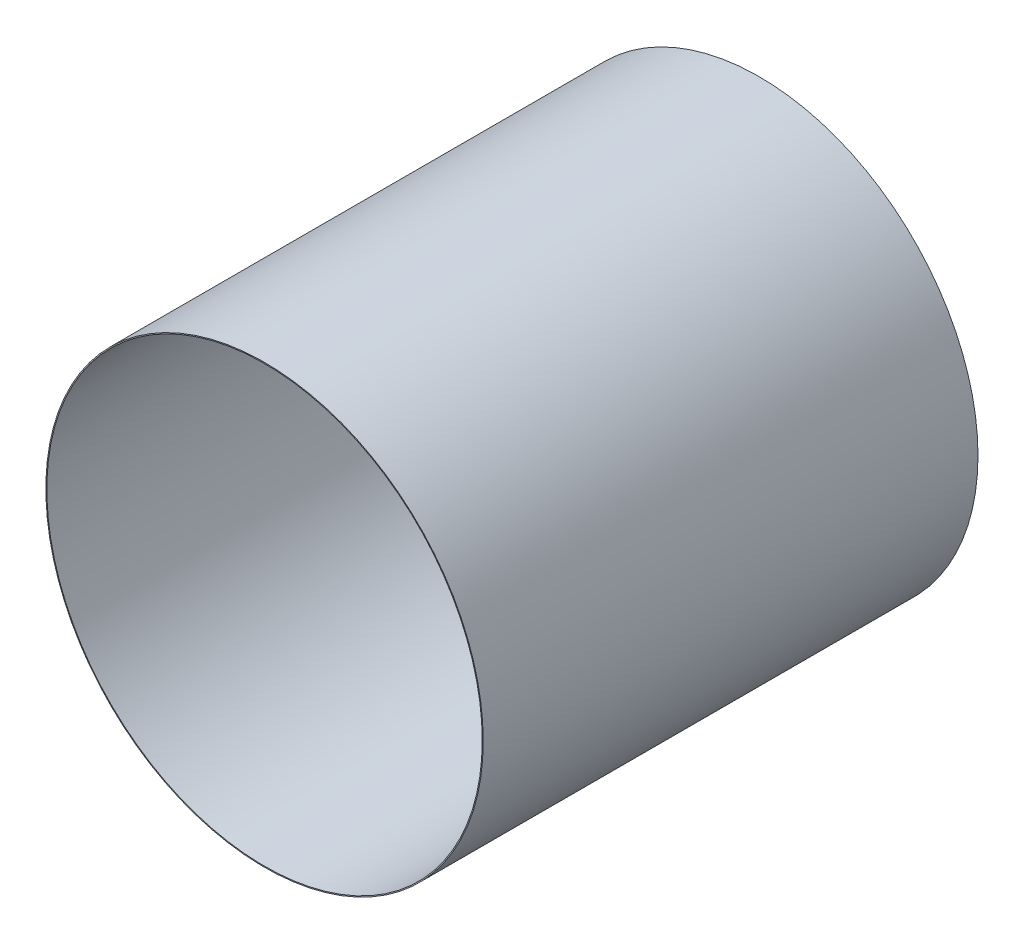
ISO-10303-21;
HEADER;
FILE_DESCRIPTION(('STEP AP214'),'2;1');
FILE_NAME('part.step','',(''),(''),'','','');
FILE_SCHEMA(('AUTOMOTIVE_DESIGN { 1 0 10303 214 1 1 1 1 }'));
ENDSEC;
DATA;
#1=APPLICATION_CONTEXT('core data for automotive mechanical design processes');
#2=APPLICATION_PROTOCOL_DEFINITION('international standard','automotive_design',2000,#1);
#3=PRODUCT_CONTEXT('',#1,'mechanical');
#4=PRODUCT('Part','Part','',(#3));
#5=PRODUCT_RELATED_PRODUCT_CATEGORY('part','',(#4));
#6=PRODUCT_DEFINITION_FORMATION('','',#4);
#7=PRODUCT_DEFINITION_CONTEXT('part definition',#1,'design');
#8=PRODUCT_DEFINITION('design','',#6,#7);
#9=PRODUCT_DEFINITION_SHAPE('','',#8);
#10=(LENGTH_UNIT() NAMED_UNIT(*) SI_UNIT(.MILLI.,.METRE.));
#11=(NAMED_UNIT(*) PLANE_ANGLE_UNIT() SI_UNIT($,.RADIAN.));
#12=(NAMED_UNIT(*) SI_UNIT($,.STERADIAN.) SOLID_ANGLE_UNIT());
#13=UNCERTAINTY_MEASURE_WITH_UNIT(LENGTH_MEASURE(1.E-05),#10,'distance_accuracy_value','');
#14=(GEOMETRIC_REPRESENTATION_CONTEXT(3) GLOBAL_UNCERTAINTY_ASSIGNED_CONTEXT((#13)) GLOBAL_UNIT_ASSIGNED_CONTEXT((#10,
#11,#12)) REPRESENTATION_CONTEXT('',''));
#15=CARTESIAN_POINT('',(0.,0.,0.));
#16=DIRECTION('',(0.,0.,1.));
#17=DIRECTION('',(1.,0.,0.));
#18=AXIS2_PLACEMENT_3D('',#15,#16,#17);
#19=CARTESIAN_POINT('',(0.,0.,25.));
#20=DIRECTION('',(0.,0.,1.));
#21=DIRECTION('',(1.,0.,0.));
#22=AXIS2_PLACEMENT_3D('',#19,#20,#21);
#23=PLANE('',#22);
#24=CARTESIAN_POINT('',(0.,0.,25.));
#25=DIRECTION('',(0.,0.,1.));
#26=DIRECTION('',(1.,0.,0.));
#27=AXIS2_PLACEMENT_3D('',#24,#25,#26);
#28=CIRCLE('',#27,11.05);
#29=CARTESIAN_POINT('',(11.05,0.,25.));
#30=VERTEX_POINT('',#29);
#31=EDGE_CURVE('E10',#30,#30,#28,.T.);
#32=ORIENTED_EDGE('',*,*,#31,.T.);
#33=EDGE_LOOP('',(#32));
#34=FACE_BOUND('',#33,.T.);
#35=CARTESIAN_POINT('',(0.,0.,25.));
#36=DIRECTION('',(0.,0.,1.));
#37=DIRECTION('',(1.,0.,0.));
#38=AXIS2_PLACEMENT_3D('',#35,#36,#37);
#39=CIRCLE('',#38,11.);
#40=CARTESIAN_POINT('',(11.,0.,25.));
#41=VERTEX_POINT('',#40);
#42=EDGE_CURVE('E42',#41,#41,#39,.T.);
#43=ORIENTED_EDGE('',*,*,#42,.F.);
#44=EDGE_LOOP('',(#43));
#45=FACE_BOUND('',#44,.T.);
#46=ADVANCED_FACE('F31',(#34,#45),#23,.T.);
#47=CARTESIAN_POINT('',(0.,0.,0.));
#48=DIRECTION('',(0.,0.,1.));
#49=DIRECTION('',(1.,0.,0.));
#50=AXIS2_PLACEMENT_3D('',#47,#48,#49);
#51=PLANE('',#50);
#52=CARTESIAN_POINT('',(0.,0.,0.));
#53=DIRECTION('',(0.,0.,1.));
#54=DIRECTION('',(1.,0.,0.));
#55=AXIS2_PLACEMENT_3D('',#52,#53,#54);
#56=CIRCLE('',#55,11.05);
#57=CARTESIAN_POINT('',(11.05,0.,0.));
#58=VERTEX_POINT('',#57);
#59=EDGE_CURVE('E35',#58,#58,#56,.T.);
#60=ORIENTED_EDGE('',*,*,#59,.F.);
#61=EDGE_LOOP('',(#60));
#62=FACE_BOUND('',#61,.T.);
#63=CARTESIAN_POINT('',(0.,0.,0.));
#64=DIRECTION('',(0.,0.,1.));
#65=DIRECTION('',(1.,0.,0.));
#66=AXIS2_PLACEMENT_3D('',#63,#64,#65);
#67=CIRCLE('',#66,11.);
#68=CARTESIAN_POINT('',(11.,0.,0.));
#69=VERTEX_POINT('',#68);
#70=EDGE_CURVE('E44',#69,#69,#67,.T.);
#71=ORIENTED_EDGE('',*,*,#70,.T.);
#72=EDGE_LOOP('',(#71));
#73=FACE_BOUND('',#72,.T.);
#74=ADVANCED_FACE('F54',(#62,#73),#51,.F.);
#75=CARTESIAN_POINT('',(0.,0.,25.));
#76=DIRECTION('',(0.,0.,-1.));
#77=DIRECTION('',(-1.,0.,0.));
#78=AXIS2_PLACEMENT_3D('',#75,#76,#77);
#79=CYLINDRICAL_SURFACE('',#78,11.05);
#80=ORIENTED_EDGE('',*,*,#31,.F.);
#81=EDGE_LOOP('',(#80));
#82=FACE_BOUND('',#81,.T.);
#83=ORIENTED_EDGE('',*,*,#59,.T.);
#84=EDGE_LOOP('',(#83));
#85=FACE_BOUND('',#84,.T.);
#86=ADVANCED_FACE('F33',(#82,#85),#79,.T.);
#87=CARTESIAN_POINT('',(0.,0.,25.));
#88=DIRECTION('',(0.,0.,-1.));
#89=DIRECTION('',(-1.,0.,0.));
#90=AXIS2_PLACEMENT_3D('',#87,#88,#89);
#91=CYLINDRICAL_SURFACE('',#90,11.);
#92=ORIENTED_EDGE('',*,*,#42,.T.);
#93=EDGE_LOOP('',(#92));
#94=FACE_BOUND('',#93,.T.);
#95=ORIENTED_EDGE('',*,*,#70,.F.);
#96=EDGE_LOOP('',(#95));
#97=FACE_BOUND('',#96,.T.);
#98=ADVANCED_FACE('F50',(#94,#97),#91,.F.);
#99=CLOSED_SHELL('',(#46,#74,#86,#98));
#100=MANIFOLD_SOLID_BREP('B2',#99);
#101=ADVANCED_BREP_SHAPE_REPRESENTATION('',(#18,#100),#14);
#102=SHAPE_DEFINITION_REPRESENTATION(#9,#101);
ENDSEC;
END-ISO-10303-21;
